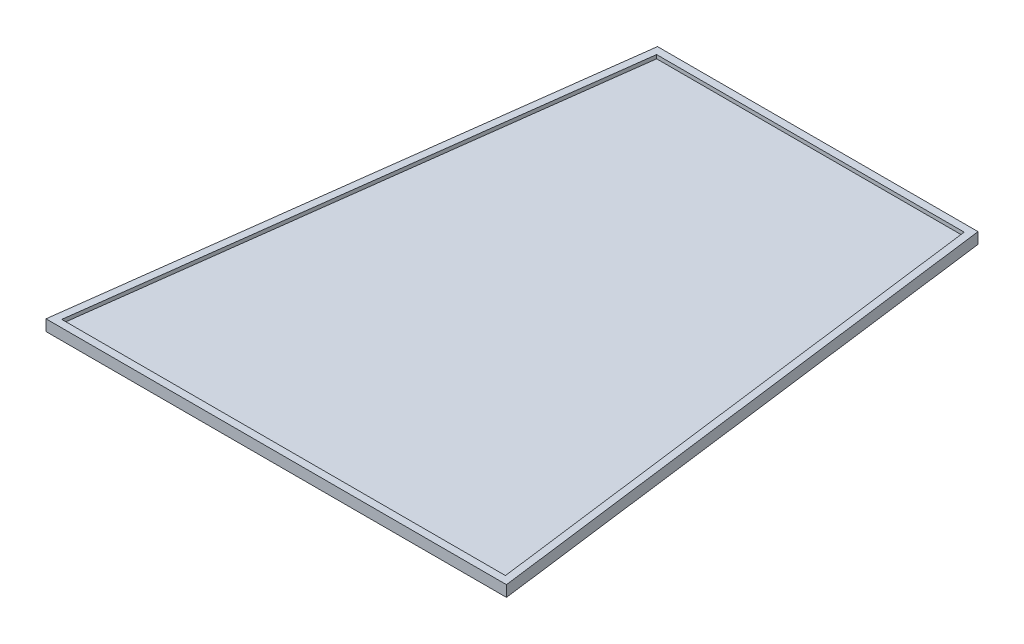
ISO-10303-21;
HEADER;
FILE_DESCRIPTION(('STEP AP214'),'2;1');
FILE_NAME('part.step','',(''),(''),'','','');
FILE_SCHEMA(('AUTOMOTIVE_DESIGN { 1 0 10303 214 1 1 1 1 }'));
ENDSEC;
DATA;
#1=APPLICATION_CONTEXT('core data for automotive mechanical design processes');
#2=APPLICATION_PROTOCOL_DEFINITION('international standard','automotive_design',2000,#1);
#3=PRODUCT_CONTEXT('',#1,'mechanical');
#4=PRODUCT('Part','Part','',(#3));
#5=PRODUCT_RELATED_PRODUCT_CATEGORY('part','',(#4));
#6=PRODUCT_DEFINITION_FORMATION('','',#4);
#7=PRODUCT_DEFINITION_CONTEXT('part definition',#1,'design');
#8=PRODUCT_DEFINITION('design','',#6,#7);
#9=PRODUCT_DEFINITION_SHAPE('','',#8);
#10=(LENGTH_UNIT() NAMED_UNIT(*) SI_UNIT(.MILLI.,.METRE.));
#11=(NAMED_UNIT(*) PLANE_ANGLE_UNIT() SI_UNIT($,.RADIAN.));
#12=(NAMED_UNIT(*) SI_UNIT($,.STERADIAN.) SOLID_ANGLE_UNIT());
#13=UNCERTAINTY_MEASURE_WITH_UNIT(LENGTH_MEASURE(1.E-05),#10,'distance_accuracy_value','');
#14=(GEOMETRIC_REPRESENTATION_CONTEXT(3) GLOBAL_UNCERTAINTY_ASSIGNED_CONTEXT((#13)) GLOBAL_UNIT_ASSIGNED_CONTEXT((#10,
#11,#12)) REPRESENTATION_CONTEXT('',''));
#15=CARTESIAN_POINT('',(0.,0.,0.));
#16=DIRECTION('',(0.,0.,1.));
#17=DIRECTION('',(1.,0.,0.));
#18=AXIS2_PLACEMENT_3D('',#15,#16,#17);
#19=CARTESIAN_POINT('',(-21.75,1.,-73.5));
#20=DIRECTION('',(0.991750221831795,0.,0.128185402821797));
#21=DIRECTION('',(0.128185402821797,0.,-0.991750221831795));
#22=AXIS2_PLACEMENT_3D('',#19,#20,#21);
#23=PLANE('',#22);
#24=DIRECTION('',(-0.128185402821797,0.,0.991750221831795));
#25=VECTOR('',#24,1.);
#26=CARTESIAN_POINT('',(-21.75,0.,-73.5));
#27=LINE('',#26,#25);
#28=CARTESIAN_POINT('',(-21.75,0.,-73.5));
#29=VERTEX_POINT('',#28);
#30=CARTESIAN_POINT('',(-31.25,0.,0.));
#31=VERTEX_POINT('',#30);
#32=EDGE_CURVE('E150',#29,#31,#27,.T.);
#33=ORIENTED_EDGE('',*,*,#32,.T.);
#34=DIRECTION('',(0.,-1.,0.));
#35=VECTOR('',#34,1.);
#36=CARTESIAN_POINT('',(-31.25,1.,0.));
#37=LINE('',#36,#35);
#38=CARTESIAN_POINT('',(-31.25,1.5,0.));
#39=VERTEX_POINT('',#38);
#40=EDGE_CURVE('E11',#39,#31,#37,.T.);
#41=ORIENTED_EDGE('',*,*,#40,.F.);
#42=DIRECTION('',(-0.128185402821797,0.,0.991750221831795));
#43=VECTOR('',#42,1.);
#44=CARTESIAN_POINT('',(-21.75,1.5,-73.5));
#45=LINE('',#44,#43);
#46=CARTESIAN_POINT('',(-21.75,1.5,-73.5));
#47=VERTEX_POINT('',#46);
#48=EDGE_CURVE('E141',#47,#39,#45,.T.);
#49=ORIENTED_EDGE('',*,*,#48,.F.);
#50=DIRECTION('',(0.,-1.,0.));
#51=VECTOR('',#50,1.);
#52=CARTESIAN_POINT('',(-21.75,1.,-73.5));
#53=LINE('',#52,#51);
#54=EDGE_CURVE('E159',#47,#29,#53,.T.);
#55=ORIENTED_EDGE('',*,*,#54,.T.);
#56=EDGE_LOOP('',(#33,#41,#49,#55));
#57=FACE_BOUND('',#56,.T.);
#58=ADVANCED_FACE('F39',(#57),#23,.F.);
#59=CARTESIAN_POINT('',(-31.25,1.,0.));
#60=DIRECTION('',(0.,0.,-1.));
#61=DIRECTION('',(-1.,0.,0.));
#62=AXIS2_PLACEMENT_3D('',#59,#60,#61);
#63=PLANE('',#62);
#64=DIRECTION('',(1.,0.,0.));
#65=VECTOR('',#64,1.);
#66=CARTESIAN_POINT('',(-31.25,0.,0.));
#67=LINE('',#66,#65);
#68=CARTESIAN_POINT('',(31.25,0.,0.));
#69=VERTEX_POINT('',#68);
#70=EDGE_CURVE('E153',#31,#69,#67,.T.);
#71=ORIENTED_EDGE('',*,*,#70,.T.);
#72=DIRECTION('',(0.,-1.,0.));
#73=VECTOR('',#72,1.);
#74=CARTESIAN_POINT('',(31.25,1.,0.));
#75=LINE('',#74,#73);
#76=CARTESIAN_POINT('',(31.25,1.5,0.));
#77=VERTEX_POINT('',#76);
#78=EDGE_CURVE('E46',#77,#69,#75,.T.);
#79=ORIENTED_EDGE('',*,*,#78,.F.);
#80=DIRECTION('',(1.,0.,0.));
#81=VECTOR('',#80,1.);
#82=CARTESIAN_POINT('',(-31.25,1.5,0.));
#83=LINE('',#82,#81);
#84=EDGE_CURVE('E144',#39,#77,#83,.T.);
#85=ORIENTED_EDGE('',*,*,#84,.F.);
#86=ORIENTED_EDGE('',*,*,#40,.T.);
#87=EDGE_LOOP('',(#71,#79,#85,#86));
#88=FACE_BOUND('',#87,.T.);
#89=ADVANCED_FACE('F181',(#88),#63,.F.);
#90=CARTESIAN_POINT('',(31.25,1.,0.));
#91=DIRECTION('',(-0.991750221831795,0.,0.128185402821797));
#92=DIRECTION('',(0.128185402821797,0.,0.991750221831795));
#93=AXIS2_PLACEMENT_3D('',#90,#91,#92);
#94=PLANE('',#93);
#95=DIRECTION('',(-0.128185402821797,0.,-0.991750221831795));
#96=VECTOR('',#95,1.);
#97=CARTESIAN_POINT('',(31.25,0.,0.));
#98=LINE('',#97,#96);
#99=CARTESIAN_POINT('',(21.75,0.,-73.5));
#100=VERTEX_POINT('',#99);
#101=EDGE_CURVE('E155',#69,#100,#98,.T.);
#102=ORIENTED_EDGE('',*,*,#101,.T.);
#103=DIRECTION('',(0.,-1.,0.));
#104=VECTOR('',#103,1.);
#105=CARTESIAN_POINT('',(21.75,1.,-73.5));
#106=LINE('',#105,#104);
#107=CARTESIAN_POINT('',(21.75,1.5,-73.5));
#108=VERTEX_POINT('',#107);
#109=EDGE_CURVE('E162',#108,#100,#106,.T.);
#110=ORIENTED_EDGE('',*,*,#109,.F.);
#111=DIRECTION('',(-0.128185402821797,0.,-0.991750221831795));
#112=VECTOR('',#111,1.);
#113=CARTESIAN_POINT('',(31.25,1.5,0.));
#114=LINE('',#113,#112);
#115=EDGE_CURVE('E147',#77,#108,#114,.T.);
#116=ORIENTED_EDGE('',*,*,#115,.F.);
#117=ORIENTED_EDGE('',*,*,#78,.T.);
#118=EDGE_LOOP('',(#102,#110,#116,#117));
#119=FACE_BOUND('',#118,.T.);
#120=ADVANCED_FACE('F168',(#119),#94,.F.);
#121=CARTESIAN_POINT('',(21.75,1.,-73.5));
#122=DIRECTION('',(0.,0.,1.));
#123=DIRECTION('',(1.,0.,0.));
#124=AXIS2_PLACEMENT_3D('',#121,#122,#123);
#125=PLANE('',#124);
#126=DIRECTION('',(-1.,0.,0.));
#127=VECTOR('',#126,1.);
#128=CARTESIAN_POINT('',(21.75,0.,-73.5));
#129=LINE('',#128,#127);
#130=EDGE_CURVE('E157',#100,#29,#129,.T.);
#131=ORIENTED_EDGE('',*,*,#130,.T.);
#132=ORIENTED_EDGE('',*,*,#54,.F.);
#133=DIRECTION('',(-1.,0.,0.));
#134=VECTOR('',#133,1.);
#135=CARTESIAN_POINT('',(21.75,1.5,-73.5));
#136=LINE('',#135,#134);
#137=EDGE_CURVE('E117',#108,#47,#136,.T.);
#138=ORIENTED_EDGE('',*,*,#137,.F.);
#139=ORIENTED_EDGE('',*,*,#109,.T.);
#140=EDGE_LOOP('',(#131,#132,#138,#139));
#141=FACE_BOUND('',#140,.T.);
#142=ADVANCED_FACE('F176',(#141),#125,.F.);
#143=CARTESIAN_POINT('',(0.,0.,0.));
#144=DIRECTION('',(0.,1.,0.));
#145=DIRECTION('',(0.,0.,1.));
#146=AXIS2_PLACEMENT_3D('',#143,#144,#145);
#147=PLANE('',#146);
#148=ORIENTED_EDGE('',*,*,#32,.F.);
#149=ORIENTED_EDGE('',*,*,#130,.F.);
#150=ORIENTED_EDGE('',*,*,#101,.F.);
#151=ORIENTED_EDGE('',*,*,#70,.F.);
#152=EDGE_LOOP('',(#148,#149,#150,#151));
#153=FACE_BOUND('',#152,.T.);
#154=ADVANCED_FACE('F174',(#153),#147,.F.);
#155=CARTESIAN_POINT('',(0.,1.5,0.));
#156=DIRECTION('',(0.,1.,0.));
#157=DIRECTION('',(0.,0.,1.));
#158=AXIS2_PLACEMENT_3D('',#155,#156,#157);
#159=PLANE('',#158);
#160=ORIENTED_EDGE('',*,*,#137,.T.);
#161=ORIENTED_EDGE('',*,*,#48,.T.);
#162=ORIENTED_EDGE('',*,*,#84,.T.);
#163=ORIENTED_EDGE('',*,*,#115,.T.);
#164=EDGE_LOOP('',(#160,#161,#162,#163));
#165=FACE_BOUND('',#164,.T.);
#166=DIRECTION('',(-0.128185402821797,0.,0.991750221831795));
#167=VECTOR('',#166,1.);
#168=CARTESIAN_POINT('',(-20.8709332975314,1.5,-72.5));
#169=LINE('',#168,#167);
#170=CARTESIAN_POINT('',(-20.8709332975314,1.5,-72.5));
#171=VERTEX_POINT('',#170);
#172=CARTESIAN_POINT('',(-30.1124298961708,1.5,-1.));
#173=VERTEX_POINT('',#172);
#174=EDGE_CURVE('E111',#171,#173,#169,.T.);
#175=ORIENTED_EDGE('',*,*,#174,.F.);
#176=DIRECTION('',(-1.,0.,0.));
#177=VECTOR('',#176,1.);
#178=CARTESIAN_POINT('',(20.8709332975314,1.5,-72.5));
#179=LINE('',#178,#177);
#180=CARTESIAN_POINT('',(20.8709332975314,1.5,-72.5));
#181=VERTEX_POINT('',#180);
#182=EDGE_CURVE('E102',#181,#171,#179,.T.);
#183=ORIENTED_EDGE('',*,*,#182,.F.);
#184=DIRECTION('',(-0.128185402821797,0.,-0.991750221831795));
#185=VECTOR('',#184,1.);
#186=CARTESIAN_POINT('',(30.1124298961708,1.5,-1.));
#187=LINE('',#186,#185);
#188=CARTESIAN_POINT('',(30.1124298961708,1.5,-1.));
#189=VERTEX_POINT('',#188);
#190=EDGE_CURVE('E125',#189,#181,#187,.T.);
#191=ORIENTED_EDGE('',*,*,#190,.F.);
#192=DIRECTION('',(1.,0.,0.));
#193=VECTOR('',#192,1.);
#194=CARTESIAN_POINT('',(-30.1124298961708,1.5,-1.));
#195=LINE('',#194,#193);
#196=EDGE_CURVE('E123',#173,#189,#195,.T.);
#197=ORIENTED_EDGE('',*,*,#196,.F.);
#198=EDGE_LOOP('',(#175,#183,#191,#197));
#199=FACE_BOUND('',#198,.T.);
#200=ADVANCED_FACE('F121',(#165,#199),#159,.T.);
#201=CARTESIAN_POINT('',(20.8709332975314,1.5,-72.5));
#202=DIRECTION('',(0.,0.,1.));
#203=DIRECTION('',(1.,0.,0.));
#204=AXIS2_PLACEMENT_3D('',#201,#202,#203);
#205=PLANE('',#204);
#206=DIRECTION('',(-1.,0.,0.));
#207=VECTOR('',#206,1.);
#208=CARTESIAN_POINT('',(20.8709332975314,1.,-72.5));
#209=LINE('',#208,#207);
#210=CARTESIAN_POINT('',(20.8709332975314,1.,-72.5));
#211=VERTEX_POINT('',#210);
#212=CARTESIAN_POINT('',(-20.8709332975314,1.,-72.5));
#213=VERTEX_POINT('',#212);
#214=EDGE_CURVE('E53',#211,#213,#209,.T.);
#215=ORIENTED_EDGE('',*,*,#214,.F.);
#216=DIRECTION('',(0.,-1.,0.));
#217=VECTOR('',#216,1.);
#218=CARTESIAN_POINT('',(20.8709332975314,1.5,-72.5));
#219=LINE('',#218,#217);
#220=EDGE_CURVE('E107',#181,#211,#219,.T.);
#221=ORIENTED_EDGE('',*,*,#220,.F.);
#222=ORIENTED_EDGE('',*,*,#182,.T.);
#223=DIRECTION('',(0.,-1.,0.));
#224=VECTOR('',#223,1.);
#225=CARTESIAN_POINT('',(-20.8709332975314,1.5,-72.5));
#226=LINE('',#225,#224);
#227=EDGE_CURVE('E105',#171,#213,#226,.T.);
#228=ORIENTED_EDGE('',*,*,#227,.T.);
#229=EDGE_LOOP('',(#215,#221,#222,#228));
#230=FACE_BOUND('',#229,.T.);
#231=ADVANCED_FACE('F104',(#230),#205,.T.);
#232=CARTESIAN_POINT('',(-20.8709332975314,1.5,-72.5));
#233=DIRECTION('',(0.991750221831795,0.,0.128185402821797));
#234=DIRECTION('',(0.128185402821797,0.,-0.991750221831795));
#235=AXIS2_PLACEMENT_3D('',#232,#233,#234);
#236=PLANE('',#235);
#237=DIRECTION('',(-0.128185402821797,0.,0.991750221831795));
#238=VECTOR('',#237,1.);
#239=CARTESIAN_POINT('',(-20.8709332975314,1.,-72.5));
#240=LINE('',#239,#238);
#241=CARTESIAN_POINT('',(-30.1124298961708,1.,-1.));
#242=VERTEX_POINT('',#241);
#243=EDGE_CURVE('E57',#213,#242,#240,.T.);
#244=ORIENTED_EDGE('',*,*,#243,.F.);
#245=ORIENTED_EDGE('',*,*,#227,.F.);
#246=ORIENTED_EDGE('',*,*,#174,.T.);
#247=DIRECTION('',(0.,-1.,0.));
#248=VECTOR('',#247,1.);
#249=CARTESIAN_POINT('',(-30.1124298961708,1.5,-1.));
#250=LINE('',#249,#248);
#251=EDGE_CURVE('E118',#173,#242,#250,.T.);
#252=ORIENTED_EDGE('',*,*,#251,.T.);
#253=EDGE_LOOP('',(#244,#245,#246,#252));
#254=FACE_BOUND('',#253,.T.);
#255=ADVANCED_FACE('F115',(#254),#236,.T.);
#256=CARTESIAN_POINT('',(-30.1124298961708,1.5,-1.));
#257=DIRECTION('',(0.,0.,-1.));
#258=DIRECTION('',(-1.,0.,0.));
#259=AXIS2_PLACEMENT_3D('',#256,#257,#258);
#260=PLANE('',#259);
#261=DIRECTION('',(1.,0.,0.));
#262=VECTOR('',#261,1.);
#263=CARTESIAN_POINT('',(-30.1124298961708,1.,-1.));
#264=LINE('',#263,#262);
#265=CARTESIAN_POINT('',(30.1124298961708,1.,-1.));
#266=VERTEX_POINT('',#265);
#267=EDGE_CURVE('E131',#242,#266,#264,.T.);
#268=ORIENTED_EDGE('',*,*,#267,.F.);
#269=ORIENTED_EDGE('',*,*,#251,.F.);
#270=ORIENTED_EDGE('',*,*,#196,.T.);
#271=DIRECTION('',(0.,-1.,0.));
#272=VECTOR('',#271,1.);
#273=CARTESIAN_POINT('',(30.1124298961708,1.5,-1.));
#274=LINE('',#273,#272);
#275=EDGE_CURVE('E135',#189,#266,#274,.T.);
#276=ORIENTED_EDGE('',*,*,#275,.T.);
#277=EDGE_LOOP('',(#268,#269,#270,#276));
#278=FACE_BOUND('',#277,.T.);
#279=ADVANCED_FACE('F203',(#278),#260,.T.);
#280=CARTESIAN_POINT('',(30.1124298961708,1.5,-1.));
#281=DIRECTION('',(-0.991750221831795,0.,0.128185402821797));
#282=DIRECTION('',(0.128185402821797,0.,0.991750221831795));
#283=AXIS2_PLACEMENT_3D('',#280,#281,#282);
#284=PLANE('',#283);
#285=DIRECTION('',(-0.128185402821797,0.,-0.991750221831795));
#286=VECTOR('',#285,1.);
#287=CARTESIAN_POINT('',(30.1124298961708,1.,-1.));
#288=LINE('',#287,#286);
#289=EDGE_CURVE('E112',#266,#211,#288,.T.);
#290=ORIENTED_EDGE('',*,*,#289,.F.);
#291=ORIENTED_EDGE('',*,*,#275,.F.);
#292=ORIENTED_EDGE('',*,*,#190,.T.);
#293=ORIENTED_EDGE('',*,*,#220,.T.);
#294=EDGE_LOOP('',(#290,#291,#292,#293));
#295=FACE_BOUND('',#294,.T.);
#296=ADVANCED_FACE('F196',(#295),#284,.T.);
#297=CARTESIAN_POINT('',(0.,1.,0.));
#298=DIRECTION('',(0.,1.,0.));
#299=DIRECTION('',(0.,0.,1.));
#300=AXIS2_PLACEMENT_3D('',#297,#298,#299);
#301=PLANE('',#300);
#302=ORIENTED_EDGE('',*,*,#214,.T.);
#303=ORIENTED_EDGE('',*,*,#243,.T.);
#304=ORIENTED_EDGE('',*,*,#267,.T.);
#305=ORIENTED_EDGE('',*,*,#289,.T.);
#306=EDGE_LOOP('',(#302,#303,#304,#305));
#307=FACE_BOUND('',#306,.T.);
#308=ADVANCED_FACE('F193',(#307),#301,.T.);
#309=CLOSED_SHELL('',(#58,#89,#120,#142,#154,#200,#231,#255,#279,#296,#308));
#310=MANIFOLD_SOLID_BREP('B2',#309);
#311=ADVANCED_BREP_SHAPE_REPRESENTATION('',(#18,#310),#14);
#312=SHAPE_DEFINITION_REPRESENTATION(#9,#311);
ENDSEC;
END-ISO-10303-21;
